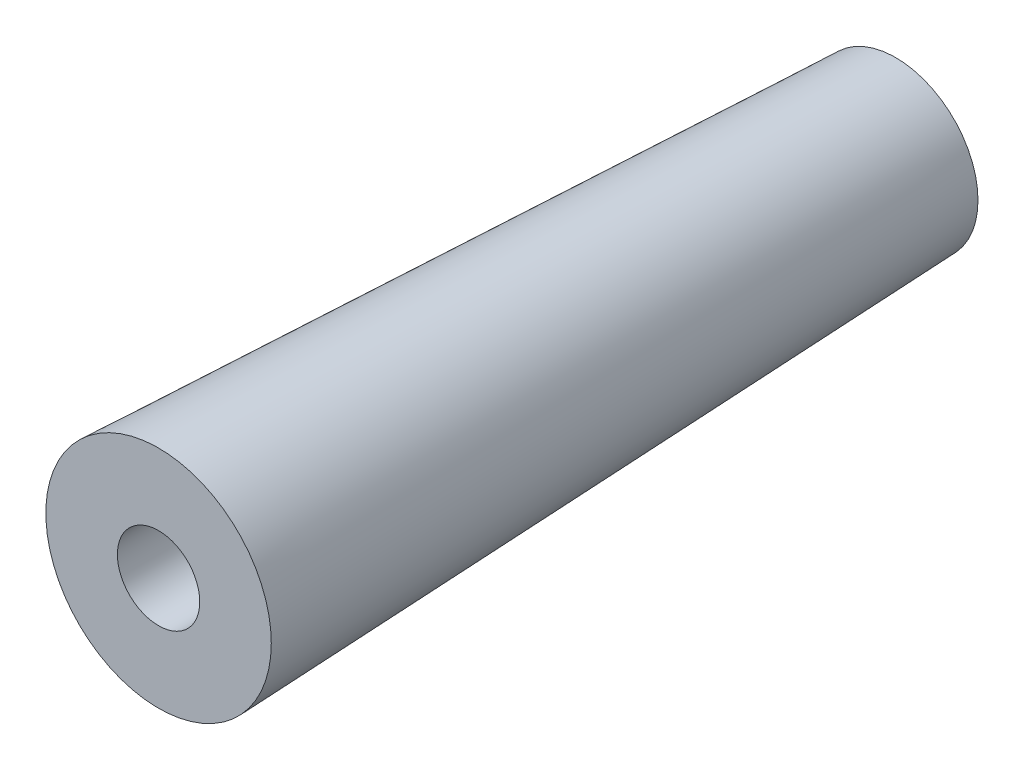
ISO-10303-21;
HEADER;
FILE_DESCRIPTION(('STEP AP214'),'2;1');
FILE_NAME('part.step','',(''),(''),'','','');
FILE_SCHEMA(('AUTOMOTIVE_DESIGN { 1 0 10303 214 1 1 1 1 }'));
ENDSEC;
DATA;
#1=APPLICATION_CONTEXT('core data for automotive mechanical design processes');
#2=APPLICATION_PROTOCOL_DEFINITION('international standard','automotive_design',2000,#1);
#3=PRODUCT_CONTEXT('',#1,'mechanical');
#4=PRODUCT('Part','Part','',(#3));
#5=PRODUCT_RELATED_PRODUCT_CATEGORY('part','',(#4));
#6=PRODUCT_DEFINITION_FORMATION('','',#4);
#7=PRODUCT_DEFINITION_CONTEXT('part definition',#1,'design');
#8=PRODUCT_DEFINITION('design','',#6,#7);
#9=PRODUCT_DEFINITION_SHAPE('','',#8);
#10=(LENGTH_UNIT() NAMED_UNIT(*) SI_UNIT(.MILLI.,.METRE.));
#11=(NAMED_UNIT(*) PLANE_ANGLE_UNIT() SI_UNIT($,.RADIAN.));
#12=(NAMED_UNIT(*) SI_UNIT($,.STERADIAN.) SOLID_ANGLE_UNIT());
#13=UNCERTAINTY_MEASURE_WITH_UNIT(LENGTH_MEASURE(1.E-05),#10,'distance_accuracy_value','');
#14=(GEOMETRIC_REPRESENTATION_CONTEXT(3) GLOBAL_UNCERTAINTY_ASSIGNED_CONTEXT((#13)) GLOBAL_UNIT_ASSIGNED_CONTEXT((#10,
#11,#12)) REPRESENTATION_CONTEXT('',''));
#15=CARTESIAN_POINT('',(0.,0.,0.));
#16=DIRECTION('',(0.,0.,1.));
#17=DIRECTION('',(1.,0.,0.));
#18=AXIS2_PLACEMENT_3D('',#15,#16,#17);
#19=CARTESIAN_POINT('',(0.,0.,85.));
#20=DIRECTION('',(0.,0.,1.));
#21=DIRECTION('',(1.,0.,0.));
#22=AXIS2_PLACEMENT_3D('',#19,#20,#21);
#23=PLANE('',#22);
#24=CARTESIAN_POINT('',(0.,0.,85.));
#25=DIRECTION('',(0.,0.,1.));
#26=DIRECTION('',(1.,0.,0.));
#27=AXIS2_PLACEMENT_3D('',#24,#25,#26);
#28=CIRCLE('',#27,4.75);
#29=CARTESIAN_POINT('',(4.75,0.,85.));
#30=VERTEX_POINT('',#29);
#31=EDGE_CURVE('E49',#30,#30,#28,.T.);
#32=ORIENTED_EDGE('',*,*,#31,.F.);
#33=EDGE_LOOP('',(#32));
#34=FACE_BOUND('',#33,.T.);
#35=CARTESIAN_POINT('',(0.,0.,85.));
#36=DIRECTION('',(0.,0.,1.));
#37=DIRECTION('',(1.,0.,0.));
#38=AXIS2_PLACEMENT_3D('',#35,#36,#37);
#39=CIRCLE('',#38,13.);
#40=CARTESIAN_POINT('',(13.,0.,85.));
#41=VERTEX_POINT('',#40);
#42=EDGE_CURVE('E40',#41,#41,#39,.T.);
#43=ORIENTED_EDGE('',*,*,#42,.T.);
#44=EDGE_LOOP('',(#43));
#45=FACE_BOUND('',#44,.T.);
#46=ADVANCED_FACE('F37',(#34,#45),#23,.T.);
#47=CARTESIAN_POINT('',(0.,0.,0.));
#48=DIRECTION('',(0.,0.,1.));
#49=DIRECTION('',(1.,0.,0.));
#50=AXIS2_PLACEMENT_3D('',#47,#48,#49);
#51=PLANE('',#50);
#52=CARTESIAN_POINT('',(0.,0.,0.));
#53=DIRECTION('',(0.,0.,1.));
#54=DIRECTION('',(1.,0.,0.));
#55=AXIS2_PLACEMENT_3D('',#52,#53,#54);
#56=CIRCLE('',#55,4.75);
#57=CARTESIAN_POINT('',(4.75,0.,0.));
#58=VERTEX_POINT('',#57);
#59=EDGE_CURVE('E47',#58,#58,#56,.T.);
#60=ORIENTED_EDGE('',*,*,#59,.T.);
#61=EDGE_LOOP('',(#60));
#62=FACE_BOUND('',#61,.T.);
#63=CARTESIAN_POINT('',(0.,0.,0.));
#64=DIRECTION('',(0.,0.,1.));
#65=DIRECTION('',(1.,0.,0.));
#66=AXIS2_PLACEMENT_3D('',#63,#64,#65);
#67=CIRCLE('',#66,9.5);
#68=CARTESIAN_POINT('',(9.5,0.,0.));
#69=VERTEX_POINT('',#68);
#70=EDGE_CURVE('E10',#69,#69,#67,.T.);
#71=ORIENTED_EDGE('',*,*,#70,.F.);
#72=EDGE_LOOP('',(#71));
#73=FACE_BOUND('',#72,.T.);
#74=ADVANCED_FACE('F55',(#62,#73),#51,.F.);
#75=CARTESIAN_POINT('',(0.,0.,0.));
#76=DIRECTION('',(0.,0.,1.));
#77=DIRECTION('',(1.,0.,0.));
#78=AXIS2_PLACEMENT_3D('',#75,#76,#77);
#79=CONICAL_SURFACE('',#78,9.5,0.041153222641443);
#80=ORIENTED_EDGE('',*,*,#70,.T.);
#81=EDGE_LOOP('',(#80));
#82=FACE_BOUND('',#81,.T.);
#83=ORIENTED_EDGE('',*,*,#42,.F.);
#84=EDGE_LOOP('',(#83));
#85=FACE_BOUND('',#84,.T.);
#86=ADVANCED_FACE('F61',(#82,#85),#79,.T.);
#87=CARTESIAN_POINT('',(0.,0.,0.));
#88=DIRECTION('',(0.,0.,1.));
#89=DIRECTION('',(1.,0.,0.));
#90=AXIS2_PLACEMENT_3D('',#87,#88,#89);
#91=CYLINDRICAL_SURFACE('',#90,4.75);
#92=ORIENTED_EDGE('',*,*,#59,.F.);
#93=EDGE_LOOP('',(#92));
#94=FACE_BOUND('',#93,.T.);
#95=ORIENTED_EDGE('',*,*,#31,.T.);
#96=EDGE_LOOP('',(#95));
#97=FACE_BOUND('',#96,.T.);
#98=ADVANCED_FACE('F58',(#94,#97),#91,.F.);
#99=CLOSED_SHELL('',(#46,#74,#86,#98));
#100=MANIFOLD_SOLID_BREP('B2',#99);
#101=ADVANCED_BREP_SHAPE_REPRESENTATION('',(#18,#100),#14);
#102=SHAPE_DEFINITION_REPRESENTATION(#9,#101);
ENDSEC;
END-ISO-10303-21;
